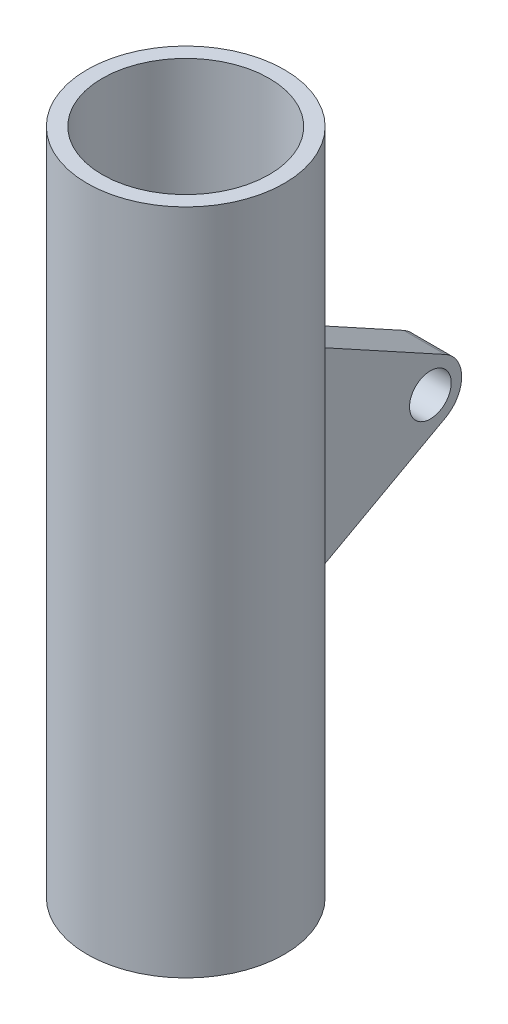
ISO-10303-21;
HEADER;
FILE_DESCRIPTION(('STEP AP214'),'2;1');
FILE_NAME('part.step','',(''),(''),'','','');
FILE_SCHEMA(('AUTOMOTIVE_DESIGN { 1 0 10303 214 1 1 1 1 }'));
ENDSEC;
DATA;
#1=APPLICATION_CONTEXT('core data for automotive mechanical design processes');
#2=APPLICATION_PROTOCOL_DEFINITION('international standard','automotive_design',2000,#1);
#3=PRODUCT_CONTEXT('',#1,'mechanical');
#4=PRODUCT('Part','Part','',(#3));
#5=PRODUCT_RELATED_PRODUCT_CATEGORY('part','',(#4));
#6=PRODUCT_DEFINITION_FORMATION('','',#4);
#7=PRODUCT_DEFINITION_CONTEXT('part definition',#1,'design');
#8=PRODUCT_DEFINITION('design','',#6,#7);
#9=PRODUCT_DEFINITION_SHAPE('','',#8);
#10=(LENGTH_UNIT() NAMED_UNIT(*) SI_UNIT(.MILLI.,.METRE.));
#11=(NAMED_UNIT(*) PLANE_ANGLE_UNIT() SI_UNIT($,.RADIAN.));
#12=(NAMED_UNIT(*) SI_UNIT($,.STERADIAN.) SOLID_ANGLE_UNIT());
#13=UNCERTAINTY_MEASURE_WITH_UNIT(LENGTH_MEASURE(1.E-05),#10,'distance_accuracy_value','');
#14=(GEOMETRIC_REPRESENTATION_CONTEXT(3) GLOBAL_UNCERTAINTY_ASSIGNED_CONTEXT((#13)) GLOBAL_UNIT_ASSIGNED_CONTEXT((#10,
#11,#12)) REPRESENTATION_CONTEXT('',''));
#15=CARTESIAN_POINT('',(0.,0.,0.));
#16=DIRECTION('',(0.,0.,1.));
#17=DIRECTION('',(1.,0.,0.));
#18=AXIS2_PLACEMENT_3D('',#15,#16,#17);
#19=CARTESIAN_POINT('',(-6.35000000000004,69.85,-80.8));
#20=DIRECTION('',(1.,0.,0.));
#21=DIRECTION('',(0.,0.,-1.));
#22=AXIS2_PLACEMENT_3D('',#19,#20,#21);
#23=PLANE('',#22);
#24=CARTESIAN_POINT('',(-6.35000000000004,101.6,-68.1));
#25=DIRECTION('',(1.,0.,0.));
#26=DIRECTION('',(0.,0.,-1.));
#27=AXIS2_PLACEMENT_3D('',#24,#25,#26);
#28=CIRCLE('',#27,9.52500000000001);
#29=CARTESIAN_POINT('',(-6.35000000000004,109.952195986169,-72.6789133218074));
#30=VERTEX_POINT('',#29);
#31=CARTESIAN_POINT('',(-6.35000000000004,93.2478040138312,-72.6789133218074));
#32=VERTEX_POINT('',#31);
#33=EDGE_CURVE('E147',#30,#32,#28,.F.);
#34=ORIENTED_EDGE('',*,*,#33,.T.);
#35=DIRECTION('',(0.,-0.480725808063766,0.876870969676519));
#36=VECTOR('',#35,1.);
#37=CARTESIAN_POINT('',(-6.35000000000004,41.0618182537194,22.5112661306016));
#38=LINE('',#37,#36);
#39=CARTESIAN_POINT('',(-6.35000000000004,69.85,-30.));
#40=VERTEX_POINT('',#39);
#41=EDGE_CURVE('E146',#32,#40,#38,.T.);
#42=ORIENTED_EDGE('',*,*,#41,.T.);
#43=DIRECTION('',(0.,0.,1.));
#44=VECTOR('',#43,1.);
#45=CARTESIAN_POINT('',(-6.35000000000004,69.85,-80.8));
#46=LINE('',#45,#44);
#47=CARTESIAN_POINT('',(-6.35000000000004,69.85,-29.3202575022799));
#48=VERTEX_POINT('',#47);
#49=EDGE_CURVE('E201',#40,#48,#46,.T.);
#50=ORIENTED_EDGE('',*,*,#49,.T.);
#51=DIRECTION('',(0.,-1.,0.));
#52=VECTOR('',#51,1.);
#53=CARTESIAN_POINT('',(-6.35000000000004,203.2,-29.3202575022799));
#54=LINE('',#53,#52);
#55=CARTESIAN_POINT('',(-6.35000000000004,133.35,-29.3202575022799));
#56=VERTEX_POINT('',#55);
#57=EDGE_CURVE('E156',#48,#56,#54,.F.);
#58=ORIENTED_EDGE('',*,*,#57,.T.);
#59=DIRECTION('',(0.,0.,1.));
#60=VECTOR('',#59,1.);
#61=CARTESIAN_POINT('',(-6.35000000000004,133.35,-80.8));
#62=LINE('',#61,#60);
#63=CARTESIAN_POINT('',(-6.35000000000004,133.35,-29.9999999999999));
#64=VERTEX_POINT('',#63);
#65=EDGE_CURVE('E99',#64,#56,#62,.T.);
#66=ORIENTED_EDGE('',*,*,#65,.F.);
#67=DIRECTION('',(0.,0.480725808063766,0.876870969676519));
#68=VECTOR('',#67,1.);
#69=CARTESIAN_POINT('',(-6.35000000000004,115.179209870445,-63.1445453799683));
#70=LINE('',#69,#68);
#71=EDGE_CURVE('E137',#30,#64,#70,.T.);
#72=ORIENTED_EDGE('',*,*,#71,.F.);
#73=EDGE_LOOP('',(#34,#42,#50,#58,#66,#72));
#74=FACE_BOUND('',#73,.T.);
#75=CARTESIAN_POINT('',(-6.35000000000004,101.6,-68.1));
#76=DIRECTION('',(1.,0.,0.));
#77=DIRECTION('',(0.,0.,-1.));
#78=AXIS2_PLACEMENT_3D('',#75,#76,#77);
#79=CIRCLE('',#78,6.34999999999999);
#80=CARTESIAN_POINT('',(-6.35000000000004,101.6,-74.45));
#81=VERTEX_POINT('',#80);
#82=EDGE_CURVE('E218',#81,#81,#79,.F.);
#83=ORIENTED_EDGE('',*,*,#82,.F.);
#84=EDGE_LOOP('',(#83));
#85=FACE_BOUND('',#84,.T.);
#86=ADVANCED_FACE('F75',(#74,#85),#23,.F.);
#87=CARTESIAN_POINT('',(6.34999999999996,133.35,-80.8));
#88=DIRECTION('',(0.,-1.,0.));
#89=DIRECTION('',(0.,0.,-1.));
#90=AXIS2_PLACEMENT_3D('',#87,#88,#89);
#91=PLANE('',#90);
#92=DIRECTION('',(-1.,0.,0.));
#93=VECTOR('',#92,1.);
#94=CARTESIAN_POINT('',(30.,133.35,-29.9999999999999));
#95=LINE('',#94,#93);
#96=CARTESIAN_POINT('',(0.,133.35,-29.9999999999999));
#97=VERTEX_POINT('',#96);
#98=EDGE_CURVE('E139',#97,#64,#95,.T.);
#99=ORIENTED_EDGE('',*,*,#98,.T.);
#100=ORIENTED_EDGE('',*,*,#65,.T.);
#101=CARTESIAN_POINT('',(0.,133.35,0.));
#102=DIRECTION('',(0.,1.,0.));
#103=DIRECTION('',(0.,0.,1.));
#104=AXIS2_PLACEMENT_3D('',#101,#102,#103);
#105=CIRCLE('',#104,30.);
#106=EDGE_CURVE('E150',#56,#97,#105,.F.);
#107=ORIENTED_EDGE('',*,*,#106,.T.);
#108=EDGE_LOOP('',(#99,#100,#107));
#109=FACE_BOUND('',#108,.T.);
#110=ADVANCED_FACE('F149',(#109),#91,.F.);
#111=CARTESIAN_POINT('',(6.34999999999996,133.35,-29.9999999999999));
#112=VERTEX_POINT('',#111);
#113=EDGE_CURVE('E151',#112,#97,#95,.T.);
#114=ORIENTED_EDGE('',*,*,#113,.T.);
#115=CARTESIAN_POINT('',(6.34999999999996,133.35,-29.3202575022799));
#116=VERTEX_POINT('',#115);
#117=EDGE_CURVE('E194',#97,#116,#105,.F.);
#118=ORIENTED_EDGE('',*,*,#117,.T.);
#119=DIRECTION('',(0.,0.,1.));
#120=VECTOR('',#119,1.);
#121=CARTESIAN_POINT('',(6.34999999999996,133.35,-80.8));
#122=LINE('',#121,#120);
#123=EDGE_CURVE('E158',#112,#116,#122,.T.);
#124=ORIENTED_EDGE('',*,*,#123,.F.);
#125=EDGE_LOOP('',(#114,#118,#124));
#126=FACE_BOUND('',#125,.T.);
#127=ADVANCED_FACE('F212',(#126),#91,.F.);
#128=CARTESIAN_POINT('',(6.34999999999996,69.85,-80.8));
#129=DIRECTION('',(-1.,0.,0.));
#130=DIRECTION('',(0.,0.,1.));
#131=AXIS2_PLACEMENT_3D('',#128,#129,#130);
#132=PLANE('',#131);
#133=DIRECTION('',(0.,0.,1.));
#134=VECTOR('',#133,1.);
#135=CARTESIAN_POINT('',(6.34999999999996,69.85,-80.8));
#136=LINE('',#135,#134);
#137=CARTESIAN_POINT('',(6.34999999999996,69.85,-30.));
#138=VERTEX_POINT('',#137);
#139=CARTESIAN_POINT('',(6.34999999999996,69.85,-29.3202575022799));
#140=VERTEX_POINT('',#139);
#141=EDGE_CURVE('E164',#138,#140,#136,.T.);
#142=ORIENTED_EDGE('',*,*,#141,.F.);
#143=DIRECTION('',(0.,0.480725808063766,-0.876870969676519));
#144=VECTOR('',#143,1.);
#145=CARTESIAN_POINT('',(6.34999999999996,91.2639528776425,-69.0602570310411));
#146=LINE('',#145,#144);
#147=CARTESIAN_POINT('',(6.34999999999996,93.2478040138311,-72.6789133218074));
#148=VERTEX_POINT('',#147);
#149=EDGE_CURVE('E91',#138,#148,#146,.T.);
#150=ORIENTED_EDGE('',*,*,#149,.T.);
#151=CARTESIAN_POINT('',(6.34999999999996,101.6,-68.1));
#152=DIRECTION('',(-1.,0.,0.));
#153=DIRECTION('',(0.,0.,1.));
#154=AXIS2_PLACEMENT_3D('',#151,#152,#153);
#155=CIRCLE('',#154,9.52500000000001);
#156=CARTESIAN_POINT('',(6.34999999999996,109.952195986169,-72.6789133218074));
#157=VERTEX_POINT('',#156);
#158=EDGE_CURVE('E12',#148,#157,#155,.F.);
#159=ORIENTED_EDGE('',*,*,#158,.T.);
#160=DIRECTION('',(0.,-0.480725808063766,-0.876870969676519));
#161=VECTOR('',#160,1.);
#162=CARTESIAN_POINT('',(6.34999999999996,97.2613684111589,-95.8276981280942));
#163=LINE('',#162,#161);
#164=EDGE_CURVE('E84',#112,#157,#163,.T.);
#165=ORIENTED_EDGE('',*,*,#164,.F.);
#166=ORIENTED_EDGE('',*,*,#123,.T.);
#167=DIRECTION('',(0.,-1.,0.));
#168=VECTOR('',#167,1.);
#169=CARTESIAN_POINT('',(6.34999999999996,203.2,-29.3202575022799));
#170=LINE('',#169,#168);
#171=EDGE_CURVE('E195',#116,#140,#170,.T.);
#172=ORIENTED_EDGE('',*,*,#171,.T.);
#173=EDGE_LOOP('',(#142,#150,#159,#165,#166,#172));
#174=FACE_BOUND('',#173,.T.);
#175=CARTESIAN_POINT('',(6.34999999999996,101.6,-68.1));
#176=DIRECTION('',(-1.,0.,0.));
#177=DIRECTION('',(0.,0.,1.));
#178=AXIS2_PLACEMENT_3D('',#175,#176,#177);
#179=CIRCLE('',#178,6.34999999999999);
#180=CARTESIAN_POINT('',(6.34999999999996,101.6,-61.75));
#181=VERTEX_POINT('',#180);
#182=EDGE_CURVE('E79',#181,#181,#179,.F.);
#183=ORIENTED_EDGE('',*,*,#182,.F.);
#184=EDGE_LOOP('',(#183));
#185=FACE_BOUND('',#184,.T.);
#186=ADVANCED_FACE('F183',(#174,#185),#132,.F.);
#187=CARTESIAN_POINT('',(6.34999999999996,69.85,-80.8));
#188=DIRECTION('',(0.,1.,0.));
#189=DIRECTION('',(0.,0.,1.));
#190=AXIS2_PLACEMENT_3D('',#187,#188,#189);
#191=PLANE('',#190);
#192=ORIENTED_EDGE('',*,*,#49,.F.);
#193=DIRECTION('',(-1.,0.,0.));
#194=VECTOR('',#193,1.);
#195=CARTESIAN_POINT('',(30.,69.85,-30.));
#196=LINE('',#195,#194);
#197=CARTESIAN_POINT('',(0.,69.85,-30.));
#198=VERTEX_POINT('',#197);
#199=EDGE_CURVE('E213',#198,#40,#196,.T.);
#200=ORIENTED_EDGE('',*,*,#199,.F.);
#201=CARTESIAN_POINT('',(0.,69.85,0.));
#202=DIRECTION('',(0.,-1.,0.));
#203=DIRECTION('',(0.,0.,-1.));
#204=AXIS2_PLACEMENT_3D('',#201,#202,#203);
#205=CIRCLE('',#204,30.);
#206=EDGE_CURVE('E197',#198,#48,#205,.F.);
#207=ORIENTED_EDGE('',*,*,#206,.T.);
#208=EDGE_LOOP('',(#192,#200,#207));
#209=FACE_BOUND('',#208,.T.);
#210=ADVANCED_FACE('F251',(#209),#191,.F.);
#211=CARTESIAN_POINT('',(0.,203.2,0.));
#212=DIRECTION('',(0.,-1.,0.));
#213=DIRECTION('',(0.,0.,-1.));
#214=AXIS2_PLACEMENT_3D('',#211,#212,#213);
#215=CYLINDRICAL_SURFACE('',#214,30.);
#216=CARTESIAN_POINT('',(0.,0.,0.));
#217=DIRECTION('',(0.,1.,0.));
#218=DIRECTION('',(0.,0.,1.));
#219=AXIS2_PLACEMENT_3D('',#216,#217,#218);
#220=CIRCLE('',#219,30.);
#221=CARTESIAN_POINT('',(0.,0.,30.));
#222=VERTEX_POINT('',#221);
#223=EDGE_CURVE('E169',#222,#222,#220,.T.);
#224=ORIENTED_EDGE('',*,*,#223,.T.);
#225=EDGE_LOOP('',(#224));
#226=FACE_BOUND('',#225,.T.);
#227=CARTESIAN_POINT('',(0.,203.2,0.));
#228=DIRECTION('',(0.,1.,0.));
#229=DIRECTION('',(0.,0.,1.));
#230=AXIS2_PLACEMENT_3D('',#227,#228,#229);
#231=CIRCLE('',#230,30.);
#232=CARTESIAN_POINT('',(0.,203.2,30.));
#233=VERTEX_POINT('',#232);
#234=EDGE_CURVE('E171',#233,#233,#231,.T.);
#235=ORIENTED_EDGE('',*,*,#234,.F.);
#236=EDGE_LOOP('',(#235));
#237=FACE_BOUND('',#236,.T.);
#238=ORIENTED_EDGE('',*,*,#57,.F.);
#239=ORIENTED_EDGE('',*,*,#206,.F.);
#240=EDGE_CURVE('E198',#140,#198,#205,.F.);
#241=ORIENTED_EDGE('',*,*,#240,.F.);
#242=ORIENTED_EDGE('',*,*,#171,.F.);
#243=ORIENTED_EDGE('',*,*,#117,.F.);
#244=ORIENTED_EDGE('',*,*,#106,.F.);
#245=EDGE_LOOP('',(#238,#239,#241,#242,#243,#244));
#246=FACE_BOUND('',#245,.T.);
#247=ADVANCED_FACE('F77',(#226,#237,#246),#215,.T.);
#248=CARTESIAN_POINT('',(0.,203.2,0.));
#249=DIRECTION('',(0.,1.,0.));
#250=DIRECTION('',(0.,0.,1.));
#251=AXIS2_PLACEMENT_3D('',#248,#249,#250);
#252=PLANE('',#251);
#253=ORIENTED_EDGE('',*,*,#234,.T.);
#254=EDGE_LOOP('',(#253));
#255=FACE_BOUND('',#254,.T.);
#256=CARTESIAN_POINT('',(0.,203.2,0.));
#257=DIRECTION('',(0.,1.,0.));
#258=DIRECTION('',(0.,0.,1.));
#259=AXIS2_PLACEMENT_3D('',#256,#257,#258);
#260=CIRCLE('',#259,25.4);
#261=CARTESIAN_POINT('',(0.,203.2,25.4));
#262=VERTEX_POINT('',#261);
#263=EDGE_CURVE('E161',#262,#262,#260,.T.);
#264=ORIENTED_EDGE('',*,*,#263,.F.);
#265=EDGE_LOOP('',(#264));
#266=FACE_BOUND('',#265,.T.);
#267=ADVANCED_FACE('F237',(#255,#266),#252,.T.);
#268=CARTESIAN_POINT('',(0.,0.,0.));
#269=DIRECTION('',(0.,1.,0.));
#270=DIRECTION('',(0.,0.,1.));
#271=AXIS2_PLACEMENT_3D('',#268,#269,#270);
#272=PLANE('',#271);
#273=ORIENTED_EDGE('',*,*,#223,.F.);
#274=EDGE_LOOP('',(#273));
#275=FACE_BOUND('',#274,.T.);
#276=CARTESIAN_POINT('',(0.,0.,0.));
#277=DIRECTION('',(0.,1.,0.));
#278=DIRECTION('',(0.,0.,1.));
#279=AXIS2_PLACEMENT_3D('',#276,#277,#278);
#280=CIRCLE('',#279,25.4);
#281=CARTESIAN_POINT('',(0.,0.,25.4));
#282=VERTEX_POINT('',#281);
#283=EDGE_CURVE('E157',#282,#282,#280,.T.);
#284=ORIENTED_EDGE('',*,*,#283,.T.);
#285=EDGE_LOOP('',(#284));
#286=FACE_BOUND('',#285,.T.);
#287=ADVANCED_FACE('F235',(#275,#286),#272,.F.);
#288=CARTESIAN_POINT('',(0.,203.2,0.));
#289=DIRECTION('',(0.,-1.,0.));
#290=DIRECTION('',(0.,0.,-1.));
#291=AXIS2_PLACEMENT_3D('',#288,#289,#290);
#292=CYLINDRICAL_SURFACE('',#291,25.4);
#293=ORIENTED_EDGE('',*,*,#263,.T.);
#294=EDGE_LOOP('',(#293));
#295=FACE_BOUND('',#294,.T.);
#296=ORIENTED_EDGE('',*,*,#283,.F.);
#297=EDGE_LOOP('',(#296));
#298=FACE_BOUND('',#297,.T.);
#299=ADVANCED_FACE('F232',(#295,#298),#292,.F.);
#300=ORIENTED_EDGE('',*,*,#240,.T.);
#301=EDGE_CURVE('E189',#138,#198,#196,.T.);
#302=ORIENTED_EDGE('',*,*,#301,.F.);
#303=ORIENTED_EDGE('',*,*,#141,.T.);
#304=EDGE_LOOP('',(#300,#302,#303));
#305=FACE_BOUND('',#304,.T.);
#306=ADVANCED_FACE('F205',(#305),#191,.F.);
#307=CARTESIAN_POINT('',(30.,101.6,-68.1));
#308=DIRECTION('',(-1.,0.,0.));
#309=DIRECTION('',(0.,-1.,0.));
#310=AXIS2_PLACEMENT_3D('',#307,#308,#309);
#311=CYLINDRICAL_SURFACE('',#310,9.52500000000001);
#312=DIRECTION('',(-1.,0.,0.));
#313=VECTOR('',#312,1.);
#314=CARTESIAN_POINT('',(30.,93.2478040138311,-72.6789133218074));
#315=LINE('',#314,#313);
#316=EDGE_CURVE('E186',#148,#32,#315,.T.);
#317=ORIENTED_EDGE('',*,*,#316,.T.);
#318=ORIENTED_EDGE('',*,*,#33,.F.);
#319=DIRECTION('',(-1.,0.,0.));
#320=VECTOR('',#319,1.);
#321=CARTESIAN_POINT('',(30.,109.952195986169,-72.6789133218074));
#322=LINE('',#321,#320);
#323=EDGE_CURVE('E142',#157,#30,#322,.T.);
#324=ORIENTED_EDGE('',*,*,#323,.F.);
#325=ORIENTED_EDGE('',*,*,#158,.F.);
#326=EDGE_LOOP('',(#317,#318,#324,#325));
#327=FACE_BOUND('',#326,.T.);
#328=ADVANCED_FACE('F180',(#327),#311,.T.);
#329=CARTESIAN_POINT('',(30.,115.179209870445,-63.1445453799683));
#330=DIRECTION('',(0.,0.876870969676519,-0.480725808063766));
#331=DIRECTION('',(0.,0.480725808063766,0.876870969676519));
#332=AXIS2_PLACEMENT_3D('',#329,#330,#331);
#333=PLANE('',#332);
#334=ORIENTED_EDGE('',*,*,#164,.T.);
#335=ORIENTED_EDGE('',*,*,#323,.T.);
#336=ORIENTED_EDGE('',*,*,#71,.T.);
#337=ORIENTED_EDGE('',*,*,#98,.F.);
#338=ORIENTED_EDGE('',*,*,#113,.F.);
#339=EDGE_LOOP('',(#334,#335,#336,#337,#338));
#340=FACE_BOUND('',#339,.T.);
#341=ADVANCED_FACE('F138',(#340),#333,.T.);
#342=CARTESIAN_POINT('',(30.,41.0618182537194,22.5112661306016));
#343=DIRECTION('',(0.,0.876870969676519,0.480725808063766));
#344=DIRECTION('',(0.,-0.480725808063766,0.876870969676519));
#345=AXIS2_PLACEMENT_3D('',#342,#343,#344);
#346=PLANE('',#345);
#347=ORIENTED_EDGE('',*,*,#301,.T.);
#348=ORIENTED_EDGE('',*,*,#199,.T.);
#349=ORIENTED_EDGE('',*,*,#41,.F.);
#350=ORIENTED_EDGE('',*,*,#316,.F.);
#351=ORIENTED_EDGE('',*,*,#149,.F.);
#352=EDGE_LOOP('',(#347,#348,#349,#350,#351));
#353=FACE_BOUND('',#352,.T.);
#354=ADVANCED_FACE('F272',(#353),#346,.F.);
#355=CARTESIAN_POINT('',(30.,101.6,-68.1));
#356=DIRECTION('',(-1.,0.,0.));
#357=DIRECTION('',(0.,-1.,0.));
#358=AXIS2_PLACEMENT_3D('',#355,#356,#357);
#359=CYLINDRICAL_SURFACE('',#358,6.34999999999999);
#360=ORIENTED_EDGE('',*,*,#82,.T.);
#361=EDGE_LOOP('',(#360));
#362=FACE_BOUND('',#361,.T.);
#363=ORIENTED_EDGE('',*,*,#182,.T.);
#364=EDGE_LOOP('',(#363));
#365=FACE_BOUND('',#364,.T.);
#366=ADVANCED_FACE('F222',(#362,#365),#359,.F.);
#367=CLOSED_SHELL('',(#86,#110,#127,#186,#210,#247,#267,#287,#299,#306,#328,#341,#354,#366));
#368=MANIFOLD_SOLID_BREP('B2',#367);
#369=ADVANCED_BREP_SHAPE_REPRESENTATION('',(#18,#368),#14);
#370=SHAPE_DEFINITION_REPRESENTATION(#9,#369);
ENDSEC;
END-ISO-10303-21;
